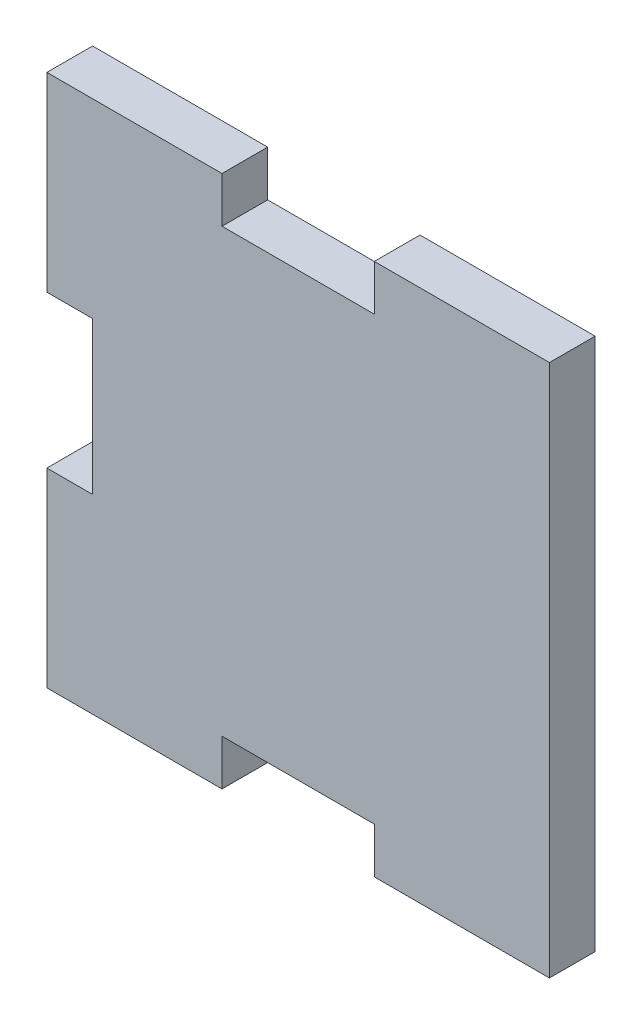
ISO-10303-21;
HEADER;
FILE_DESCRIPTION(('STEP AP214'),'2;1');
FILE_NAME('part.step','',(''),(''),'','','');
FILE_SCHEMA(('AUTOMOTIVE_DESIGN { 1 0 10303 214 1 1 1 1 }'));
ENDSEC;
DATA;
#1=APPLICATION_CONTEXT('core data for automotive mechanical design processes');
#2=APPLICATION_PROTOCOL_DEFINITION('international standard','automotive_design',2000,#1);
#3=PRODUCT_CONTEXT('',#1,'mechanical');
#4=PRODUCT('Part','Part','',(#3));
#5=PRODUCT_RELATED_PRODUCT_CATEGORY('part','',(#4));
#6=PRODUCT_DEFINITION_FORMATION('','',#4);
#7=PRODUCT_DEFINITION_CONTEXT('part definition',#1,'design');
#8=PRODUCT_DEFINITION('design','',#6,#7);
#9=PRODUCT_DEFINITION_SHAPE('','',#8);
#10=(LENGTH_UNIT() NAMED_UNIT(*) SI_UNIT(.MILLI.,.METRE.));
#11=(NAMED_UNIT(*) PLANE_ANGLE_UNIT() SI_UNIT($,.RADIAN.));
#12=(NAMED_UNIT(*) SI_UNIT($,.STERADIAN.) SOLID_ANGLE_UNIT());
#13=UNCERTAINTY_MEASURE_WITH_UNIT(LENGTH_MEASURE(1.E-05),#10,'distance_accuracy_value','');
#14=(GEOMETRIC_REPRESENTATION_CONTEXT(3) GLOBAL_UNCERTAINTY_ASSIGNED_CONTEXT((#13)) GLOBAL_UNIT_ASSIGNED_CONTEXT((#10,
#11,#12)) REPRESENTATION_CONTEXT('',''));
#15=CARTESIAN_POINT('',(0.,0.,0.));
#16=DIRECTION('',(0.,0.,1.));
#17=DIRECTION('',(1.,0.,0.));
#18=AXIS2_PLACEMENT_3D('',#15,#16,#17);
#19=CARTESIAN_POINT('',(-13.5,0.,3.));
#20=DIRECTION('',(1.,0.,0.));
#21=DIRECTION('',(0.,1.,0.));
#22=AXIS2_PLACEMENT_3D('',#19,#20,#21);
#23=PLANE('',#22);
#24=DIRECTION('',(0.,-1.,0.));
#25=VECTOR('',#24,1.);
#26=CARTESIAN_POINT('',(-13.5,0.,0.));
#27=LINE('',#26,#25);
#28=CARTESIAN_POINT('',(-13.5,5.,0.));
#29=VERTEX_POINT('',#28);
#30=CARTESIAN_POINT('',(-13.5,-5.,0.));
#31=VERTEX_POINT('',#30);
#32=EDGE_CURVE('E231',#29,#31,#27,.T.);
#33=ORIENTED_EDGE('',*,*,#32,.T.);
#34=DIRECTION('',(0.,0.,-1.));
#35=VECTOR('',#34,1.);
#36=CARTESIAN_POINT('',(-13.5,-5.,3.));
#37=LINE('',#36,#35);
#38=CARTESIAN_POINT('',(-13.5,-5.,3.));
#39=VERTEX_POINT('',#38);
#40=EDGE_CURVE('E11',#39,#31,#37,.T.);
#41=ORIENTED_EDGE('',*,*,#40,.F.);
#42=DIRECTION('',(0.,-1.,0.));
#43=VECTOR('',#42,1.);
#44=CARTESIAN_POINT('',(-13.5,0.,3.));
#45=LINE('',#44,#43);
#46=CARTESIAN_POINT('',(-13.5,5.,3.));
#47=VERTEX_POINT('',#46);
#48=EDGE_CURVE('E185',#47,#39,#45,.T.);
#49=ORIENTED_EDGE('',*,*,#48,.F.);
#50=DIRECTION('',(0.,0.,-1.));
#51=VECTOR('',#50,1.);
#52=CARTESIAN_POINT('',(-13.5,5.,3.));
#53=LINE('',#52,#51);
#54=EDGE_CURVE('E175',#47,#29,#53,.T.);
#55=ORIENTED_EDGE('',*,*,#54,.T.);
#56=EDGE_LOOP('',(#33,#41,#49,#55));
#57=FACE_BOUND('',#56,.T.);
#58=ADVANCED_FACE('F35',(#57),#23,.F.);
#59=CARTESIAN_POINT('',(0.,-5.,3.));
#60=DIRECTION('',(0.,-1.,0.));
#61=DIRECTION('',(0.,0.,-1.));
#62=AXIS2_PLACEMENT_3D('',#59,#60,#61);
#63=PLANE('',#62);
#64=DIRECTION('',(-1.,0.,0.));
#65=VECTOR('',#64,1.);
#66=CARTESIAN_POINT('',(0.,-5.,0.));
#67=LINE('',#66,#65);
#68=CARTESIAN_POINT('',(-16.5,-5.,0.));
#69=VERTEX_POINT('',#68);
#70=EDGE_CURVE('E226',#31,#69,#67,.T.);
#71=ORIENTED_EDGE('',*,*,#70,.T.);
#72=DIRECTION('',(0.,0.,-1.));
#73=VECTOR('',#72,1.);
#74=CARTESIAN_POINT('',(-16.5,-5.,3.));
#75=LINE('',#74,#73);
#76=CARTESIAN_POINT('',(-16.5,-5.,3.));
#77=VERTEX_POINT('',#76);
#78=EDGE_CURVE('E43',#77,#69,#75,.T.);
#79=ORIENTED_EDGE('',*,*,#78,.F.);
#80=DIRECTION('',(-1.,0.,0.));
#81=VECTOR('',#80,1.);
#82=CARTESIAN_POINT('',(0.,-5.,3.));
#83=LINE('',#82,#81);
#84=EDGE_CURVE('E114',#39,#77,#83,.T.);
#85=ORIENTED_EDGE('',*,*,#84,.F.);
#86=ORIENTED_EDGE('',*,*,#40,.T.);
#87=EDGE_LOOP('',(#71,#79,#85,#86));
#88=FACE_BOUND('',#87,.T.);
#89=ADVANCED_FACE('F227',(#88),#63,.F.);
#90=CARTESIAN_POINT('',(-16.5,0.,3.));
#91=DIRECTION('',(-1.,0.,0.));
#92=DIRECTION('',(0.,0.,1.));
#93=AXIS2_PLACEMENT_3D('',#90,#91,#92);
#94=PLANE('',#93);
#95=DIRECTION('',(0.,1.,0.));
#96=VECTOR('',#95,1.);
#97=CARTESIAN_POINT('',(-16.5,0.,0.));
#98=LINE('',#97,#96);
#99=CARTESIAN_POINT('',(-16.5,-17.5,0.));
#100=VERTEX_POINT('',#99);
#101=EDGE_CURVE('E192',#100,#69,#98,.T.);
#102=ORIENTED_EDGE('',*,*,#101,.F.);
#103=DIRECTION('',(0.,0.,-1.));
#104=VECTOR('',#103,1.);
#105=CARTESIAN_POINT('',(-16.5,-17.5,3.));
#106=LINE('',#105,#104);
#107=CARTESIAN_POINT('',(-16.5,-17.5,3.));
#108=VERTEX_POINT('',#107);
#109=EDGE_CURVE('E221',#108,#100,#106,.T.);
#110=ORIENTED_EDGE('',*,*,#109,.F.);
#111=DIRECTION('',(0.,1.,0.));
#112=VECTOR('',#111,1.);
#113=CARTESIAN_POINT('',(-16.5,0.,3.));
#114=LINE('',#113,#112);
#115=EDGE_CURVE('E174',#108,#77,#114,.T.);
#116=ORIENTED_EDGE('',*,*,#115,.T.);
#117=ORIENTED_EDGE('',*,*,#78,.T.);
#118=EDGE_LOOP('',(#102,#110,#116,#117));
#119=FACE_BOUND('',#118,.T.);
#120=ADVANCED_FACE('F224',(#119),#94,.T.);
#121=CARTESIAN_POINT('',(0.,-17.5,3.));
#122=DIRECTION('',(0.,1.,0.));
#123=DIRECTION('',(-1.,0.,0.));
#124=AXIS2_PLACEMENT_3D('',#121,#122,#123);
#125=PLANE('',#124);
#126=DIRECTION('',(1.,0.,0.));
#127=VECTOR('',#126,1.);
#128=CARTESIAN_POINT('',(0.,-17.5,0.));
#129=LINE('',#128,#127);
#130=CARTESIAN_POINT('',(-5.,-17.5,0.));
#131=VERTEX_POINT('',#130);
#132=EDGE_CURVE('E237',#100,#131,#129,.T.);
#133=ORIENTED_EDGE('',*,*,#132,.T.);
#134=DIRECTION('',(0.,0.,-1.));
#135=VECTOR('',#134,1.);
#136=CARTESIAN_POINT('',(-5.,-17.5,3.));
#137=LINE('',#136,#135);
#138=CARTESIAN_POINT('',(-5.,-17.5,3.));
#139=VERTEX_POINT('',#138);
#140=EDGE_CURVE('E219',#139,#131,#137,.T.);
#141=ORIENTED_EDGE('',*,*,#140,.F.);
#142=DIRECTION('',(1.,0.,0.));
#143=VECTOR('',#142,1.);
#144=CARTESIAN_POINT('',(0.,-17.5,3.));
#145=LINE('',#144,#143);
#146=EDGE_CURVE('E180',#108,#139,#145,.T.);
#147=ORIENTED_EDGE('',*,*,#146,.F.);
#148=ORIENTED_EDGE('',*,*,#109,.T.);
#149=EDGE_LOOP('',(#133,#141,#147,#148));
#150=FACE_BOUND('',#149,.T.);
#151=ADVANCED_FACE('F332',(#150),#125,.F.);
#152=CARTESIAN_POINT('',(-5.,0.,3.));
#153=DIRECTION('',(1.,0.,0.));
#154=DIRECTION('',(0.,0.,-1.));
#155=AXIS2_PLACEMENT_3D('',#152,#153,#154);
#156=PLANE('',#155);
#157=DIRECTION('',(0.,-1.,0.));
#158=VECTOR('',#157,1.);
#159=CARTESIAN_POINT('',(-5.,0.,0.));
#160=LINE('',#159,#158);
#161=CARTESIAN_POINT('',(-5.,-14.5,0.));
#162=VERTEX_POINT('',#161);
#163=EDGE_CURVE('E238',#162,#131,#160,.T.);
#164=ORIENTED_EDGE('',*,*,#163,.F.);
#165=DIRECTION('',(0.,0.,-1.));
#166=VECTOR('',#165,1.);
#167=CARTESIAN_POINT('',(-5.,-14.5,3.));
#168=LINE('',#167,#166);
#169=CARTESIAN_POINT('',(-5.,-14.5,3.));
#170=VERTEX_POINT('',#169);
#171=EDGE_CURVE('E217',#170,#162,#168,.T.);
#172=ORIENTED_EDGE('',*,*,#171,.F.);
#173=DIRECTION('',(0.,-1.,0.));
#174=VECTOR('',#173,1.);
#175=CARTESIAN_POINT('',(-5.,0.,3.));
#176=LINE('',#175,#174);
#177=EDGE_CURVE('E183',#170,#139,#176,.T.);
#178=ORIENTED_EDGE('',*,*,#177,.T.);
#179=ORIENTED_EDGE('',*,*,#140,.T.);
#180=EDGE_LOOP('',(#164,#172,#178,#179));
#181=FACE_BOUND('',#180,.T.);
#182=ADVANCED_FACE('F284',(#181),#156,.T.);
#183=CARTESIAN_POINT('',(0.,-14.5,3.));
#184=DIRECTION('',(0.,-1.,0.));
#185=DIRECTION('',(0.,0.,-1.));
#186=AXIS2_PLACEMENT_3D('',#183,#184,#185);
#187=PLANE('',#186);
#188=DIRECTION('',(-1.,0.,0.));
#189=VECTOR('',#188,1.);
#190=CARTESIAN_POINT('',(0.,-14.5,0.));
#191=LINE('',#190,#189);
#192=CARTESIAN_POINT('',(5.,-14.5,0.));
#193=VERTEX_POINT('',#192);
#194=EDGE_CURVE('E244',#193,#162,#191,.T.);
#195=ORIENTED_EDGE('',*,*,#194,.F.);
#196=DIRECTION('',(0.,0.,-1.));
#197=VECTOR('',#196,1.);
#198=CARTESIAN_POINT('',(5.,-14.5,3.));
#199=LINE('',#198,#197);
#200=CARTESIAN_POINT('',(5.,-14.5,3.));
#201=VERTEX_POINT('',#200);
#202=EDGE_CURVE('E215',#201,#193,#199,.T.);
#203=ORIENTED_EDGE('',*,*,#202,.F.);
#204=DIRECTION('',(-1.,0.,0.));
#205=VECTOR('',#204,1.);
#206=CARTESIAN_POINT('',(0.,-14.5,3.));
#207=LINE('',#206,#205);
#208=EDGE_CURVE('E277',#201,#170,#207,.T.);
#209=ORIENTED_EDGE('',*,*,#208,.T.);
#210=ORIENTED_EDGE('',*,*,#171,.T.);
#211=EDGE_LOOP('',(#195,#203,#209,#210));
#212=FACE_BOUND('',#211,.T.);
#213=ADVANCED_FACE('F290',(#212),#187,.T.);
#214=CARTESIAN_POINT('',(5.,0.,3.));
#215=DIRECTION('',(1.,0.,0.));
#216=DIRECTION('',(0.,0.,-1.));
#217=AXIS2_PLACEMENT_3D('',#214,#215,#216);
#218=PLANE('',#217);
#219=DIRECTION('',(0.,-1.,0.));
#220=VECTOR('',#219,1.);
#221=CARTESIAN_POINT('',(5.,0.,0.));
#222=LINE('',#221,#220);
#223=CARTESIAN_POINT('',(5.,-17.5,0.));
#224=VERTEX_POINT('',#223);
#225=EDGE_CURVE('E247',#193,#224,#222,.T.);
#226=ORIENTED_EDGE('',*,*,#225,.T.);
#227=DIRECTION('',(0.,0.,-1.));
#228=VECTOR('',#227,1.);
#229=CARTESIAN_POINT('',(5.,-17.5,3.));
#230=LINE('',#229,#228);
#231=CARTESIAN_POINT('',(5.,-17.5,3.));
#232=VERTEX_POINT('',#231);
#233=EDGE_CURVE('E212',#232,#224,#230,.T.);
#234=ORIENTED_EDGE('',*,*,#233,.F.);
#235=DIRECTION('',(0.,-1.,0.));
#236=VECTOR('',#235,1.);
#237=CARTESIAN_POINT('',(5.,0.,3.));
#238=LINE('',#237,#236);
#239=EDGE_CURVE('E275',#201,#232,#238,.T.);
#240=ORIENTED_EDGE('',*,*,#239,.F.);
#241=ORIENTED_EDGE('',*,*,#202,.T.);
#242=EDGE_LOOP('',(#226,#234,#240,#241));
#243=FACE_BOUND('',#242,.T.);
#244=ADVANCED_FACE('F295',(#243),#218,.F.);
#245=CARTESIAN_POINT('',(16.5,-17.5,0.));
#246=VERTEX_POINT('',#245);
#247=EDGE_CURVE('E240',#224,#246,#129,.T.);
#248=ORIENTED_EDGE('',*,*,#247,.T.);
#249=DIRECTION('',(0.,0.,-1.));
#250=VECTOR('',#249,1.);
#251=CARTESIAN_POINT('',(16.5,-17.5,3.));
#252=LINE('',#251,#250);
#253=CARTESIAN_POINT('',(16.5,-17.5,3.));
#254=VERTEX_POINT('',#253);
#255=EDGE_CURVE('E209',#254,#246,#252,.T.);
#256=ORIENTED_EDGE('',*,*,#255,.F.);
#257=EDGE_CURVE('E184',#232,#254,#145,.T.);
#258=ORIENTED_EDGE('',*,*,#257,.F.);
#259=ORIENTED_EDGE('',*,*,#233,.T.);
#260=EDGE_LOOP('',(#248,#256,#258,#259));
#261=FACE_BOUND('',#260,.T.);
#262=ADVANCED_FACE('F302',(#261),#125,.F.);
#263=CARTESIAN_POINT('',(16.5,0.,3.));
#264=DIRECTION('',(-1.,0.,0.));
#265=DIRECTION('',(0.,0.,1.));
#266=AXIS2_PLACEMENT_3D('',#263,#264,#265);
#267=PLANE('',#266);
#268=DIRECTION('',(0.,1.,0.));
#269=VECTOR('',#268,1.);
#270=CARTESIAN_POINT('',(16.5,0.,0.));
#271=LINE('',#270,#269);
#272=CARTESIAN_POINT('',(16.5,17.5,0.));
#273=VERTEX_POINT('',#272);
#274=EDGE_CURVE('E249',#246,#273,#271,.T.);
#275=ORIENTED_EDGE('',*,*,#274,.T.);
#276=DIRECTION('',(0.,0.,-1.));
#277=VECTOR('',#276,1.);
#278=CARTESIAN_POINT('',(16.5,17.5,3.));
#279=LINE('',#278,#277);
#280=CARTESIAN_POINT('',(16.5,17.5,3.));
#281=VERTEX_POINT('',#280);
#282=EDGE_CURVE('E207',#281,#273,#279,.T.);
#283=ORIENTED_EDGE('',*,*,#282,.F.);
#284=DIRECTION('',(0.,1.,0.));
#285=VECTOR('',#284,1.);
#286=CARTESIAN_POINT('',(16.5,0.,3.));
#287=LINE('',#286,#285);
#288=EDGE_CURVE('E273',#254,#281,#287,.T.);
#289=ORIENTED_EDGE('',*,*,#288,.F.);
#290=ORIENTED_EDGE('',*,*,#255,.T.);
#291=EDGE_LOOP('',(#275,#283,#289,#290));
#292=FACE_BOUND('',#291,.T.);
#293=ADVANCED_FACE('F306',(#292),#267,.F.);
#294=CARTESIAN_POINT('',(0.,17.5,3.));
#295=DIRECTION('',(0.,1.,0.));
#296=DIRECTION('',(-1.,0.,0.));
#297=AXIS2_PLACEMENT_3D('',#294,#295,#296);
#298=PLANE('',#297);
#299=DIRECTION('',(1.,0.,0.));
#300=VECTOR('',#299,1.);
#301=CARTESIAN_POINT('',(0.,17.5,0.));
#302=LINE('',#301,#300);
#303=CARTESIAN_POINT('',(5.,17.5,0.));
#304=VERTEX_POINT('',#303);
#305=EDGE_CURVE('E252',#304,#273,#302,.T.);
#306=ORIENTED_EDGE('',*,*,#305,.F.);
#307=DIRECTION('',(0.,0.,-1.));
#308=VECTOR('',#307,1.);
#309=CARTESIAN_POINT('',(5.,17.5,3.));
#310=LINE('',#309,#308);
#311=CARTESIAN_POINT('',(5.,17.5,3.));
#312=VERTEX_POINT('',#311);
#313=EDGE_CURVE('E205',#312,#304,#310,.T.);
#314=ORIENTED_EDGE('',*,*,#313,.F.);
#315=DIRECTION('',(1.,0.,0.));
#316=VECTOR('',#315,1.);
#317=CARTESIAN_POINT('',(0.,17.5,3.));
#318=LINE('',#317,#316);
#319=EDGE_CURVE('E171',#312,#281,#318,.T.);
#320=ORIENTED_EDGE('',*,*,#319,.T.);
#321=ORIENTED_EDGE('',*,*,#282,.T.);
#322=EDGE_LOOP('',(#306,#314,#320,#321));
#323=FACE_BOUND('',#322,.T.);
#324=ADVANCED_FACE('F309',(#323),#298,.T.);
#325=CARTESIAN_POINT('',(5.,0.,3.));
#326=DIRECTION('',(-1.,0.,0.));
#327=DIRECTION('',(0.,0.,1.));
#328=AXIS2_PLACEMENT_3D('',#325,#326,#327);
#329=PLANE('',#328);
#330=DIRECTION('',(0.,1.,0.));
#331=VECTOR('',#330,1.);
#332=CARTESIAN_POINT('',(5.,0.,0.));
#333=LINE('',#332,#331);
#334=CARTESIAN_POINT('',(5.,14.5,0.));
#335=VERTEX_POINT('',#334);
#336=EDGE_CURVE('E255',#335,#304,#333,.T.);
#337=ORIENTED_EDGE('',*,*,#336,.F.);
#338=DIRECTION('',(0.,0.,-1.));
#339=VECTOR('',#338,1.);
#340=CARTESIAN_POINT('',(5.,14.5,3.));
#341=LINE('',#340,#339);
#342=CARTESIAN_POINT('',(5.,14.5,3.));
#343=VERTEX_POINT('',#342);
#344=EDGE_CURVE('E203',#343,#335,#341,.T.);
#345=ORIENTED_EDGE('',*,*,#344,.F.);
#346=DIRECTION('',(0.,1.,0.));
#347=VECTOR('',#346,1.);
#348=CARTESIAN_POINT('',(5.,0.,3.));
#349=LINE('',#348,#347);
#350=EDGE_CURVE('E269',#343,#312,#349,.T.);
#351=ORIENTED_EDGE('',*,*,#350,.T.);
#352=ORIENTED_EDGE('',*,*,#313,.T.);
#353=EDGE_LOOP('',(#337,#345,#351,#352));
#354=FACE_BOUND('',#353,.T.);
#355=ADVANCED_FACE('F313',(#354),#329,.T.);
#356=CARTESIAN_POINT('',(0.,14.5,3.));
#357=DIRECTION('',(0.,-1.,0.));
#358=DIRECTION('',(0.,0.,-1.));
#359=AXIS2_PLACEMENT_3D('',#356,#357,#358);
#360=PLANE('',#359);
#361=DIRECTION('',(-1.,0.,0.));
#362=VECTOR('',#361,1.);
#363=CARTESIAN_POINT('',(0.,14.5,0.));
#364=LINE('',#363,#362);
#365=CARTESIAN_POINT('',(-5.,14.5,0.));
#366=VERTEX_POINT('',#365);
#367=EDGE_CURVE('E257',#335,#366,#364,.T.);
#368=ORIENTED_EDGE('',*,*,#367,.T.);
#369=DIRECTION('',(0.,0.,-1.));
#370=VECTOR('',#369,1.);
#371=CARTESIAN_POINT('',(-5.,14.5,3.));
#372=LINE('',#371,#370);
#373=CARTESIAN_POINT('',(-5.,14.5,3.));
#374=VERTEX_POINT('',#373);
#375=EDGE_CURVE('E200',#374,#366,#372,.T.);
#376=ORIENTED_EDGE('',*,*,#375,.F.);
#377=DIRECTION('',(-1.,0.,0.));
#378=VECTOR('',#377,1.);
#379=CARTESIAN_POINT('',(0.,14.5,3.));
#380=LINE('',#379,#378);
#381=EDGE_CURVE('E267',#343,#374,#380,.T.);
#382=ORIENTED_EDGE('',*,*,#381,.F.);
#383=ORIENTED_EDGE('',*,*,#344,.T.);
#384=EDGE_LOOP('',(#368,#376,#382,#383));
#385=FACE_BOUND('',#384,.T.);
#386=ADVANCED_FACE('F315',(#385),#360,.F.);
#387=CARTESIAN_POINT('',(-5.,0.,3.));
#388=DIRECTION('',(-1.,0.,0.));
#389=DIRECTION('',(0.,0.,1.));
#390=AXIS2_PLACEMENT_3D('',#387,#388,#389);
#391=PLANE('',#390);
#392=DIRECTION('',(0.,1.,0.));
#393=VECTOR('',#392,1.);
#394=CARTESIAN_POINT('',(-5.,0.,0.));
#395=LINE('',#394,#393);
#396=CARTESIAN_POINT('',(-5.,17.5,0.));
#397=VERTEX_POINT('',#396);
#398=EDGE_CURVE('E195',#366,#397,#395,.T.);
#399=ORIENTED_EDGE('',*,*,#398,.T.);
#400=DIRECTION('',(0.,0.,-1.));
#401=VECTOR('',#400,1.);
#402=CARTESIAN_POINT('',(-5.,17.5,3.));
#403=LINE('',#402,#401);
#404=CARTESIAN_POINT('',(-5.,17.5,3.));
#405=VERTEX_POINT('',#404);
#406=EDGE_CURVE('E163',#405,#397,#403,.T.);
#407=ORIENTED_EDGE('',*,*,#406,.F.);
#408=DIRECTION('',(0.,1.,0.));
#409=VECTOR('',#408,1.);
#410=CARTESIAN_POINT('',(-5.,0.,3.));
#411=LINE('',#410,#409);
#412=EDGE_CURVE('E168',#374,#405,#411,.T.);
#413=ORIENTED_EDGE('',*,*,#412,.F.);
#414=ORIENTED_EDGE('',*,*,#375,.T.);
#415=EDGE_LOOP('',(#399,#407,#413,#414));
#416=FACE_BOUND('',#415,.T.);
#417=ADVANCED_FACE('F316',(#416),#391,.F.);
#418=CARTESIAN_POINT('',(-16.5,17.5,0.));
#419=VERTEX_POINT('',#418);
#420=EDGE_CURVE('E158',#419,#397,#302,.T.);
#421=ORIENTED_EDGE('',*,*,#420,.F.);
#422=DIRECTION('',(0.,0.,-1.));
#423=VECTOR('',#422,1.);
#424=CARTESIAN_POINT('',(-16.5,17.5,3.));
#425=LINE('',#424,#423);
#426=CARTESIAN_POINT('',(-16.5,17.5,3.));
#427=VERTEX_POINT('',#426);
#428=EDGE_CURVE('E153',#427,#419,#425,.T.);
#429=ORIENTED_EDGE('',*,*,#428,.F.);
#430=EDGE_CURVE('E156',#427,#405,#318,.T.);
#431=ORIENTED_EDGE('',*,*,#430,.T.);
#432=ORIENTED_EDGE('',*,*,#406,.T.);
#433=EDGE_LOOP('',(#421,#429,#431,#432));
#434=FACE_BOUND('',#433,.T.);
#435=ADVANCED_FACE('F155',(#434),#298,.T.);
#436=CARTESIAN_POINT('',(-16.5,5.,0.));
#437=VERTEX_POINT('',#436);
#438=EDGE_CURVE('E189',#437,#419,#98,.T.);
#439=ORIENTED_EDGE('',*,*,#438,.F.);
#440=DIRECTION('',(0.,0.,-1.));
#441=VECTOR('',#440,1.);
#442=CARTESIAN_POINT('',(-16.5,5.,3.));
#443=LINE('',#442,#441);
#444=CARTESIAN_POINT('',(-16.5,5.,3.));
#445=VERTEX_POINT('',#444);
#446=EDGE_CURVE('E103',#445,#437,#443,.T.);
#447=ORIENTED_EDGE('',*,*,#446,.F.);
#448=EDGE_CURVE('E166',#445,#427,#114,.T.);
#449=ORIENTED_EDGE('',*,*,#448,.T.);
#450=ORIENTED_EDGE('',*,*,#428,.T.);
#451=EDGE_LOOP('',(#439,#447,#449,#450));
#452=FACE_BOUND('',#451,.T.);
#453=ADVANCED_FACE('F172',(#452),#94,.T.);
#454=CARTESIAN_POINT('',(0.,5.,3.));
#455=DIRECTION('',(0.,1.,0.));
#456=DIRECTION('',(0.,0.,1.));
#457=AXIS2_PLACEMENT_3D('',#454,#455,#456);
#458=PLANE('',#457);
#459=DIRECTION('',(1.,0.,0.));
#460=VECTOR('',#459,1.);
#461=CARTESIAN_POINT('',(0.,5.,0.));
#462=LINE('',#461,#460);
#463=EDGE_CURVE('E106',#437,#29,#462,.T.);
#464=ORIENTED_EDGE('',*,*,#463,.T.);
#465=ORIENTED_EDGE('',*,*,#54,.F.);
#466=DIRECTION('',(1.,0.,0.));
#467=VECTOR('',#466,1.);
#468=CARTESIAN_POINT('',(0.,5.,3.));
#469=LINE('',#468,#467);
#470=EDGE_CURVE('E51',#445,#47,#469,.T.);
#471=ORIENTED_EDGE('',*,*,#470,.F.);
#472=ORIENTED_EDGE('',*,*,#446,.T.);
#473=EDGE_LOOP('',(#464,#465,#471,#472));
#474=FACE_BOUND('',#473,.T.);
#475=ADVANCED_FACE('F353',(#474),#458,.F.);
#476=CARTESIAN_POINT('',(0.,0.,3.));
#477=DIRECTION('',(0.,0.,1.));
#478=DIRECTION('',(1.,0.,0.));
#479=AXIS2_PLACEMENT_3D('',#476,#477,#478);
#480=PLANE('',#479);
#481=ORIENTED_EDGE('',*,*,#48,.T.);
#482=ORIENTED_EDGE('',*,*,#84,.T.);
#483=ORIENTED_EDGE('',*,*,#115,.F.);
#484=ORIENTED_EDGE('',*,*,#146,.T.);
#485=ORIENTED_EDGE('',*,*,#177,.F.);
#486=ORIENTED_EDGE('',*,*,#208,.F.);
#487=ORIENTED_EDGE('',*,*,#239,.T.);
#488=ORIENTED_EDGE('',*,*,#257,.T.);
#489=ORIENTED_EDGE('',*,*,#288,.T.);
#490=ORIENTED_EDGE('',*,*,#319,.F.);
#491=ORIENTED_EDGE('',*,*,#350,.F.);
#492=ORIENTED_EDGE('',*,*,#381,.T.);
#493=ORIENTED_EDGE('',*,*,#412,.T.);
#494=ORIENTED_EDGE('',*,*,#430,.F.);
#495=ORIENTED_EDGE('',*,*,#448,.F.);
#496=ORIENTED_EDGE('',*,*,#470,.T.);
#497=EDGE_LOOP('',(#481,#482,#483,#484,#485,#486,#487,#488,#489,#490,#491,#492,#493,#494,#495,#496));
#498=FACE_BOUND('',#497,.T.);
#499=ADVANCED_FACE('F165',(#498),#480,.T.);
#500=CARTESIAN_POINT('',(0.,0.,0.));
#501=DIRECTION('',(0.,0.,1.));
#502=DIRECTION('',(1.,0.,0.));
#503=AXIS2_PLACEMENT_3D('',#500,#501,#502);
#504=PLANE('',#503);
#505=ORIENTED_EDGE('',*,*,#32,.F.);
#506=ORIENTED_EDGE('',*,*,#463,.F.);
#507=ORIENTED_EDGE('',*,*,#438,.T.);
#508=ORIENTED_EDGE('',*,*,#420,.T.);
#509=ORIENTED_EDGE('',*,*,#398,.F.);
#510=ORIENTED_EDGE('',*,*,#367,.F.);
#511=ORIENTED_EDGE('',*,*,#336,.T.);
#512=ORIENTED_EDGE('',*,*,#305,.T.);
#513=ORIENTED_EDGE('',*,*,#274,.F.);
#514=ORIENTED_EDGE('',*,*,#247,.F.);
#515=ORIENTED_EDGE('',*,*,#225,.F.);
#516=ORIENTED_EDGE('',*,*,#194,.T.);
#517=ORIENTED_EDGE('',*,*,#163,.T.);
#518=ORIENTED_EDGE('',*,*,#132,.F.);
#519=ORIENTED_EDGE('',*,*,#101,.T.);
#520=ORIENTED_EDGE('',*,*,#70,.F.);
#521=EDGE_LOOP('',(#505,#506,#507,#508,#509,#510,#511,#512,#513,#514,#515,#516,#517,#518,#519,#520));
#522=FACE_BOUND('',#521,.T.);
#523=ADVANCED_FACE('F234',(#522),#504,.F.);
#524=CLOSED_SHELL('',(#58,#89,#120,#151,#182,#213,#244,#262,#293,#324,#355,#386,#417,#435,#453,
#475,#499,#523));
#525=MANIFOLD_SOLID_BREP('B2',#524);
#526=ADVANCED_BREP_SHAPE_REPRESENTATION('',(#18,#525),#14);
#527=SHAPE_DEFINITION_REPRESENTATION(#9,#526);
ENDSEC;
END-ISO-10303-21;
